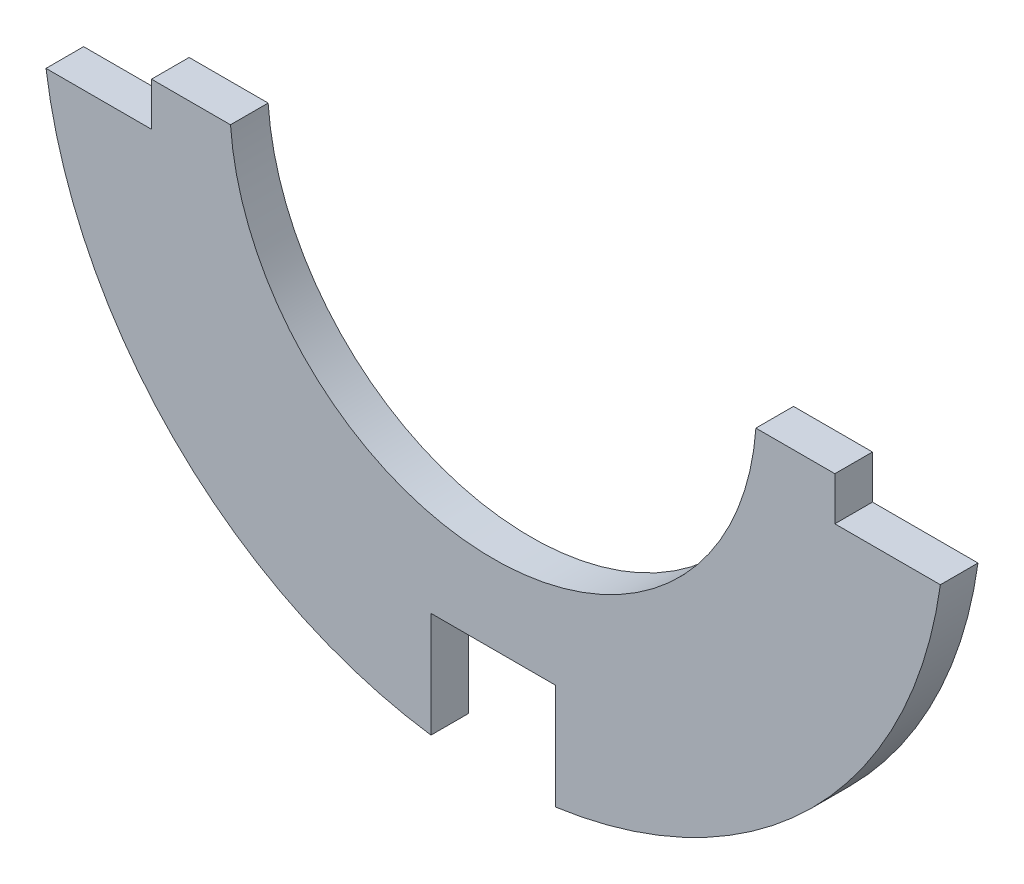
ISO-10303-21;
HEADER;
FILE_DESCRIPTION(('STEP AP214'),'2;1');
FILE_NAME('part.step','',(''),(''),'','','');
FILE_SCHEMA(('AUTOMOTIVE_DESIGN { 1 0 10303 214 1 1 1 1 }'));
ENDSEC;
DATA;
#1=APPLICATION_CONTEXT('core data for automotive mechanical design processes');
#2=APPLICATION_PROTOCOL_DEFINITION('international standard','automotive_design',2000,#1);
#3=PRODUCT_CONTEXT('',#1,'mechanical');
#4=PRODUCT('Part','Part','',(#3));
#5=PRODUCT_RELATED_PRODUCT_CATEGORY('part','',(#4));
#6=PRODUCT_DEFINITION_FORMATION('','',#4);
#7=PRODUCT_DEFINITION_CONTEXT('part definition',#1,'design');
#8=PRODUCT_DEFINITION('design','',#6,#7);
#9=PRODUCT_DEFINITION_SHAPE('','',#8);
#10=(LENGTH_UNIT() NAMED_UNIT(*) SI_UNIT(.MILLI.,.METRE.));
#11=(NAMED_UNIT(*) PLANE_ANGLE_UNIT() SI_UNIT($,.RADIAN.));
#12=(NAMED_UNIT(*) SI_UNIT($,.STERADIAN.) SOLID_ANGLE_UNIT());
#13=UNCERTAINTY_MEASURE_WITH_UNIT(LENGTH_MEASURE(1.E-05),#10,'distance_accuracy_value','');
#14=(GEOMETRIC_REPRESENTATION_CONTEXT(3) GLOBAL_UNCERTAINTY_ASSIGNED_CONTEXT((#13)) GLOBAL_UNIT_ASSIGNED_CONTEXT((#10,
#11,#12)) REPRESENTATION_CONTEXT('',''));
#15=CARTESIAN_POINT('',(0.,0.,0.));
#16=DIRECTION('',(0.,0.,1.));
#17=DIRECTION('',(1.,0.,0.));
#18=AXIS2_PLACEMENT_3D('',#15,#16,#17);
#19=CARTESIAN_POINT('',(21.0000000000125,-150.946215586875,6.35));
#20=DIRECTION('',(-1.,0.,0.));
#21=DIRECTION('',(0.,0.,1.));
#22=AXIS2_PLACEMENT_3D('',#19,#20,#21);
#23=PLANE('',#22);
#24=DIRECTION('',(0.,1.,0.));
#25=VECTOR('',#24,1.);
#26=CARTESIAN_POINT('',(21.0000000000125,-150.946215586875,-6.35));
#27=LINE('',#26,#25);
#28=CARTESIAN_POINT('',(21.0000000000124,-150.946215586875,-6.35));
#29=VERTEX_POINT('',#28);
#30=CARTESIAN_POINT('',(21.0000000000125,-115.332000000002,-6.35));
#31=VERTEX_POINT('',#30);
#32=EDGE_CURVE('E124',#29,#31,#27,.T.);
#33=ORIENTED_EDGE('',*,*,#32,.F.);
#34=DIRECTION('',(0.,0.,-1.));
#35=VECTOR('',#34,1.);
#36=CARTESIAN_POINT('',(21.0000000000124,-150.946215586875,6.35));
#37=LINE('',#36,#35);
#38=CARTESIAN_POINT('',(21.0000000000124,-150.946215586875,6.35));
#39=VERTEX_POINT('',#38);
#40=EDGE_CURVE('E11',#39,#29,#37,.T.);
#41=ORIENTED_EDGE('',*,*,#40,.F.);
#42=DIRECTION('',(0.,1.,0.));
#43=VECTOR('',#42,1.);
#44=CARTESIAN_POINT('',(21.0000000000125,-150.946215586875,6.35));
#45=LINE('',#44,#43);
#46=CARTESIAN_POINT('',(21.0000000000125,-115.332000000002,6.35));
#47=VERTEX_POINT('',#46);
#48=EDGE_CURVE('E140',#39,#47,#45,.T.);
#49=ORIENTED_EDGE('',*,*,#48,.T.);
#50=DIRECTION('',(0.,0.,-1.));
#51=VECTOR('',#50,1.);
#52=CARTESIAN_POINT('',(21.0000000000125,-115.332000000002,6.35));
#53=LINE('',#52,#51);
#54=EDGE_CURVE('E37',#47,#31,#53,.T.);
#55=ORIENTED_EDGE('',*,*,#54,.T.);
#56=EDGE_LOOP('',(#33,#41,#49,#55));
#57=FACE_BOUND('',#56,.T.);
#58=ADVANCED_FACE('F34',(#57),#23,.T.);
#59=CARTESIAN_POINT('',(0.,0.,6.35));
#60=DIRECTION('',(0.,0.,-1.));
#61=DIRECTION('',(-1.,0.,0.));
#62=AXIS2_PLACEMENT_3D('',#59,#60,#61);
#63=CYLINDRICAL_SURFACE('',#62,152.4);
#64=CARTESIAN_POINT('',(0.,0.,-6.35));
#65=DIRECTION('',(0.,0.,1.));
#66=DIRECTION('',(1.,0.,0.));
#67=AXIS2_PLACEMENT_3D('',#64,#65,#66);
#68=CIRCLE('',#67,152.4);
#69=CARTESIAN_POINT('',(150.946215586876,-21.0000000000047,-6.35));
#70=VERTEX_POINT('',#69);
#71=EDGE_CURVE('E74',#29,#70,#68,.T.);
#72=ORIENTED_EDGE('',*,*,#71,.T.);
#73=DIRECTION('',(0.,0.,-1.));
#74=VECTOR('',#73,1.);
#75=CARTESIAN_POINT('',(150.946215586876,-21.0000000000047,6.35));
#76=LINE('',#75,#74);
#77=CARTESIAN_POINT('',(150.946215586876,-21.0000000000047,6.35));
#78=VERTEX_POINT('',#77);
#79=EDGE_CURVE('E43',#78,#70,#76,.T.);
#80=ORIENTED_EDGE('',*,*,#79,.F.);
#81=CARTESIAN_POINT('',(0.,0.,6.35));
#82=DIRECTION('',(0.,0.,1.));
#83=DIRECTION('',(1.,0.,0.));
#84=AXIS2_PLACEMENT_3D('',#81,#82,#83);
#85=CIRCLE('',#84,152.4);
#86=EDGE_CURVE('E102',#39,#78,#85,.T.);
#87=ORIENTED_EDGE('',*,*,#86,.F.);
#88=ORIENTED_EDGE('',*,*,#40,.T.);
#89=EDGE_LOOP('',(#72,#80,#87,#88));
#90=FACE_BOUND('',#89,.T.);
#91=ADVANCED_FACE('F261',(#90),#63,.T.);
#92=CARTESIAN_POINT('',(150.946215586876,-21.0000000000046,6.35));
#93=DIRECTION('',(0.,-1.,0.));
#94=DIRECTION('',(1.,0.,0.));
#95=AXIS2_PLACEMENT_3D('',#92,#93,#94);
#96=PLANE('',#95);
#97=DIRECTION('',(-1.,0.,0.));
#98=VECTOR('',#97,1.);
#99=CARTESIAN_POINT('',(150.946215586876,-21.0000000000046,-6.35));
#100=LINE('',#99,#98);
#101=CARTESIAN_POINT('',(115.332,-21.0000000000046,-6.35));
#102=VERTEX_POINT('',#101);
#103=EDGE_CURVE('E109',#70,#102,#100,.T.);
#104=ORIENTED_EDGE('',*,*,#103,.T.);
#105=DIRECTION('',(0.,0.,-1.));
#106=VECTOR('',#105,1.);
#107=CARTESIAN_POINT('',(115.332,-21.0000000000046,6.35));
#108=LINE('',#107,#106);
#109=CARTESIAN_POINT('',(115.332,-21.0000000000046,6.35));
#110=VERTEX_POINT('',#109);
#111=EDGE_CURVE('E106',#110,#102,#108,.T.);
#112=ORIENTED_EDGE('',*,*,#111,.F.);
#113=DIRECTION('',(-1.,0.,0.));
#114=VECTOR('',#113,1.);
#115=CARTESIAN_POINT('',(150.946215586876,-21.0000000000046,6.35));
#116=LINE('',#115,#114);
#117=EDGE_CURVE('E96',#78,#110,#116,.T.);
#118=ORIENTED_EDGE('',*,*,#117,.F.);
#119=ORIENTED_EDGE('',*,*,#79,.T.);
#120=EDGE_LOOP('',(#104,#112,#118,#119));
#121=FACE_BOUND('',#120,.T.);
#122=ADVANCED_FACE('F107',(#121),#96,.F.);
#123=CARTESIAN_POINT('',(115.332,-21.0000000000046,6.35));
#124=DIRECTION('',(-1.,0.,0.));
#125=DIRECTION('',(0.,0.,1.));
#126=AXIS2_PLACEMENT_3D('',#123,#124,#125);
#127=PLANE('',#126);
#128=DIRECTION('',(0.,1.,0.));
#129=VECTOR('',#128,1.);
#130=CARTESIAN_POINT('',(115.332,-21.0000000000046,-6.35));
#131=LINE('',#130,#129);
#132=CARTESIAN_POINT('',(115.332,-6.35000000000017,-6.35));
#133=VERTEX_POINT('',#132);
#134=EDGE_CURVE('E137',#102,#133,#131,.T.);
#135=ORIENTED_EDGE('',*,*,#134,.T.);
#136=DIRECTION('',(0.,0.,-1.));
#137=VECTOR('',#136,1.);
#138=CARTESIAN_POINT('',(115.332,-6.35000000000017,6.35));
#139=LINE('',#138,#137);
#140=CARTESIAN_POINT('',(115.332,-6.35000000000017,6.35));
#141=VERTEX_POINT('',#140);
#142=EDGE_CURVE('E112',#141,#133,#139,.T.);
#143=ORIENTED_EDGE('',*,*,#142,.F.);
#144=DIRECTION('',(0.,1.,0.));
#145=VECTOR('',#144,1.);
#146=CARTESIAN_POINT('',(115.332,-21.0000000000046,6.35));
#147=LINE('',#146,#145);
#148=EDGE_CURVE('E100',#110,#141,#147,.T.);
#149=ORIENTED_EDGE('',*,*,#148,.F.);
#150=ORIENTED_EDGE('',*,*,#111,.T.);
#151=EDGE_LOOP('',(#135,#143,#149,#150));
#152=FACE_BOUND('',#151,.T.);
#153=ADVANCED_FACE('F114',(#152),#127,.F.);
#154=CARTESIAN_POINT('',(115.332,-6.35000000000017,6.35));
#155=DIRECTION('',(0.,-1.,0.));
#156=DIRECTION('',(1.,0.,0.));
#157=AXIS2_PLACEMENT_3D('',#154,#155,#156);
#158=PLANE('',#157);
#159=DIRECTION('',(-1.,0.,0.));
#160=VECTOR('',#159,1.);
#161=CARTESIAN_POINT('',(115.332,-6.35000000000017,-6.35));
#162=LINE('',#161,#160);
#163=CARTESIAN_POINT('',(88.6729242779328,-6.35000000000079,-6.35));
#164=VERTEX_POINT('',#163);
#165=EDGE_CURVE('E134',#133,#164,#162,.T.);
#166=ORIENTED_EDGE('',*,*,#165,.T.);
#167=DIRECTION('',(0.,0.,-1.));
#168=VECTOR('',#167,1.);
#169=CARTESIAN_POINT('',(88.6729242779328,-6.35000000000079,6.35));
#170=LINE('',#169,#168);
#171=CARTESIAN_POINT('',(88.6729242779328,-6.35000000000079,6.35));
#172=VERTEX_POINT('',#171);
#173=EDGE_CURVE('E143',#172,#164,#170,.T.);
#174=ORIENTED_EDGE('',*,*,#173,.F.);
#175=DIRECTION('',(-1.,0.,0.));
#176=VECTOR('',#175,1.);
#177=CARTESIAN_POINT('',(115.332,-6.35000000000017,6.35));
#178=LINE('',#177,#176);
#179=EDGE_CURVE('E117',#141,#172,#178,.T.);
#180=ORIENTED_EDGE('',*,*,#179,.F.);
#181=ORIENTED_EDGE('',*,*,#142,.T.);
#182=EDGE_LOOP('',(#166,#174,#180,#181));
#183=FACE_BOUND('',#182,.T.);
#184=ADVANCED_FACE('F159',(#183),#158,.F.);
#185=CARTESIAN_POINT('',(0.,0.,6.35));
#186=DIRECTION('',(0.,0.,-1.));
#187=DIRECTION('',(-1.,0.,0.));
#188=AXIS2_PLACEMENT_3D('',#185,#186,#187);
#189=CYLINDRICAL_SURFACE('',#188,88.9);
#190=CARTESIAN_POINT('',(0.,0.,-6.35));
#191=DIRECTION('',(0.,0.,1.));
#192=DIRECTION('',(1.,0.,0.));
#193=AXIS2_PLACEMENT_3D('',#190,#191,#192);
#194=CIRCLE('',#193,88.9);
#195=CARTESIAN_POINT('',(-88.6729242779328,-6.35000000000079,-6.35));
#196=VERTEX_POINT('',#195);
#197=EDGE_CURVE('E131',#196,#164,#194,.T.);
#198=ORIENTED_EDGE('',*,*,#197,.F.);
#199=DIRECTION('',(0.,0.,-1.));
#200=VECTOR('',#199,1.);
#201=CARTESIAN_POINT('',(-88.6729242779328,-6.35000000000079,6.35));
#202=LINE('',#201,#200);
#203=CARTESIAN_POINT('',(-88.6729242779328,-6.35000000000079,6.35));
#204=VERTEX_POINT('',#203);
#205=EDGE_CURVE('E171',#204,#196,#202,.T.);
#206=ORIENTED_EDGE('',*,*,#205,.F.);
#207=CARTESIAN_POINT('',(0.,0.,6.35));
#208=DIRECTION('',(0.,0.,1.));
#209=DIRECTION('',(1.,0.,0.));
#210=AXIS2_PLACEMENT_3D('',#207,#208,#209);
#211=CIRCLE('',#210,88.9);
#212=EDGE_CURVE('E119',#204,#172,#211,.T.);
#213=ORIENTED_EDGE('',*,*,#212,.T.);
#214=ORIENTED_EDGE('',*,*,#173,.T.);
#215=EDGE_LOOP('',(#198,#206,#213,#214));
#216=FACE_BOUND('',#215,.T.);
#217=ADVANCED_FACE('F172',(#216),#189,.F.);
#218=CARTESIAN_POINT('',(1.25013773452466E-11,-115.332000000002,6.35));
#219=DIRECTION('',(0.,1.,0.));
#220=DIRECTION('',(-1.,0.,0.));
#221=AXIS2_PLACEMENT_3D('',#218,#219,#220);
#222=PLANE('',#221);
#223=DIRECTION('',(1.,0.,0.));
#224=VECTOR('',#223,1.);
#225=CARTESIAN_POINT('',(1.25013773452466E-11,-115.332000000002,-6.35));
#226=LINE('',#225,#224);
#227=CARTESIAN_POINT('',(-21.0000000000125,-115.332000000002,-6.35));
#228=VERTEX_POINT('',#227);
#229=EDGE_CURVE('E127',#228,#31,#226,.T.);
#230=ORIENTED_EDGE('',*,*,#229,.T.);
#231=ORIENTED_EDGE('',*,*,#54,.F.);
#232=DIRECTION('',(1.,0.,0.));
#233=VECTOR('',#232,1.);
#234=CARTESIAN_POINT('',(1.25013773452466E-11,-115.332000000002,6.35));
#235=LINE('',#234,#233);
#236=CARTESIAN_POINT('',(-21.0000000000125,-115.332000000002,6.35));
#237=VERTEX_POINT('',#236);
#238=EDGE_CURVE('E84',#237,#47,#235,.T.);
#239=ORIENTED_EDGE('',*,*,#238,.F.);
#240=DIRECTION('',(0.,0.,-1.));
#241=VECTOR('',#240,1.);
#242=CARTESIAN_POINT('',(-21.0000000000125,-115.332000000002,6.35));
#243=LINE('',#242,#241);
#244=EDGE_CURVE('E128',#237,#228,#243,.T.);
#245=ORIENTED_EDGE('',*,*,#244,.T.);
#246=EDGE_LOOP('',(#230,#231,#239,#245));
#247=FACE_BOUND('',#246,.T.);
#248=ADVANCED_FACE('F151',(#247),#222,.F.);
#249=CARTESIAN_POINT('',(0.,0.,6.35));
#250=DIRECTION('',(0.,0.,1.));
#251=DIRECTION('',(1.,0.,0.));
#252=AXIS2_PLACEMENT_3D('',#249,#250,#251);
#253=PLANE('',#252);
#254=ORIENTED_EDGE('',*,*,#48,.F.);
#255=ORIENTED_EDGE('',*,*,#86,.T.);
#256=ORIENTED_EDGE('',*,*,#117,.T.);
#257=ORIENTED_EDGE('',*,*,#148,.T.);
#258=ORIENTED_EDGE('',*,*,#179,.T.);
#259=ORIENTED_EDGE('',*,*,#212,.F.);
#260=DIRECTION('',(1.,0.,0.));
#261=VECTOR('',#260,1.);
#262=CARTESIAN_POINT('',(-115.332,-6.35000000000017,6.35));
#263=LINE('',#262,#261);
#264=CARTESIAN_POINT('',(-115.332,-6.35000000000017,6.35));
#265=VERTEX_POINT('',#264);
#266=EDGE_CURVE('E167',#265,#204,#263,.T.);
#267=ORIENTED_EDGE('',*,*,#266,.F.);
#268=DIRECTION('',(0.,1.,0.));
#269=VECTOR('',#268,1.);
#270=CARTESIAN_POINT('',(-115.332,-21.0000000000046,6.35));
#271=LINE('',#270,#269);
#272=CARTESIAN_POINT('',(-115.332,-21.0000000000046,6.35));
#273=VERTEX_POINT('',#272);
#274=EDGE_CURVE('E183',#273,#265,#271,.T.);
#275=ORIENTED_EDGE('',*,*,#274,.F.);
#276=DIRECTION('',(1.,0.,0.));
#277=VECTOR('',#276,1.);
#278=CARTESIAN_POINT('',(-150.946215586876,-21.0000000000046,6.35));
#279=LINE('',#278,#277);
#280=CARTESIAN_POINT('',(-150.946215586876,-21.0000000000047,6.35));
#281=VERTEX_POINT('',#280);
#282=EDGE_CURVE('E188',#281,#273,#279,.T.);
#283=ORIENTED_EDGE('',*,*,#282,.F.);
#284=CARTESIAN_POINT('',(0.,0.,6.35));
#285=DIRECTION('',(0.,0.,-1.));
#286=DIRECTION('',(-1.,0.,0.));
#287=AXIS2_PLACEMENT_3D('',#284,#285,#286);
#288=CIRCLE('',#287,152.4);
#289=CARTESIAN_POINT('',(-21.0000000000124,-150.946215586875,6.35));
#290=VERTEX_POINT('',#289);
#291=EDGE_CURVE('E225',#290,#281,#288,.T.);
#292=ORIENTED_EDGE('',*,*,#291,.F.);
#293=DIRECTION('',(0.,1.,0.));
#294=VECTOR('',#293,1.);
#295=CARTESIAN_POINT('',(-21.0000000000125,-150.946215586875,6.35));
#296=LINE('',#295,#294);
#297=EDGE_CURVE('E205',#290,#237,#296,.T.);
#298=ORIENTED_EDGE('',*,*,#297,.T.);
#299=ORIENTED_EDGE('',*,*,#238,.T.);
#300=EDGE_LOOP('',(#254,#255,#256,#257,#258,#259,#267,#275,#283,#292,#298,#299));
#301=FACE_BOUND('',#300,.T.);
#302=ADVANCED_FACE('F98',(#301),#253,.T.);
#303=CARTESIAN_POINT('',(0.,0.,-6.35));
#304=DIRECTION('',(0.,0.,1.));
#305=DIRECTION('',(1.,0.,0.));
#306=AXIS2_PLACEMENT_3D('',#303,#304,#305);
#307=PLANE('',#306);
#308=ORIENTED_EDGE('',*,*,#32,.T.);
#309=ORIENTED_EDGE('',*,*,#229,.F.);
#310=DIRECTION('',(0.,1.,0.));
#311=VECTOR('',#310,1.);
#312=CARTESIAN_POINT('',(-21.0000000000125,-150.946215586875,-6.35));
#313=LINE('',#312,#311);
#314=CARTESIAN_POINT('',(-21.0000000000124,-150.946215586875,-6.35));
#315=VERTEX_POINT('',#314);
#316=EDGE_CURVE('E192',#315,#228,#313,.T.);
#317=ORIENTED_EDGE('',*,*,#316,.F.);
#318=CARTESIAN_POINT('',(0.,0.,-6.35));
#319=DIRECTION('',(0.,0.,-1.));
#320=DIRECTION('',(-1.,0.,0.));
#321=AXIS2_PLACEMENT_3D('',#318,#319,#320);
#322=CIRCLE('',#321,152.4);
#323=CARTESIAN_POINT('',(-150.946215586876,-21.0000000000047,-6.35));
#324=VERTEX_POINT('',#323);
#325=EDGE_CURVE('E194',#315,#324,#322,.T.);
#326=ORIENTED_EDGE('',*,*,#325,.T.);
#327=DIRECTION('',(1.,0.,0.));
#328=VECTOR('',#327,1.);
#329=CARTESIAN_POINT('',(-150.946215586876,-21.0000000000046,-6.35));
#330=LINE('',#329,#328);
#331=CARTESIAN_POINT('',(-115.332,-21.0000000000046,-6.35));
#332=VERTEX_POINT('',#331);
#333=EDGE_CURVE('E197',#324,#332,#330,.T.);
#334=ORIENTED_EDGE('',*,*,#333,.T.);
#335=DIRECTION('',(0.,1.,0.));
#336=VECTOR('',#335,1.);
#337=CARTESIAN_POINT('',(-115.332,-21.0000000000046,-6.35));
#338=LINE('',#337,#336);
#339=CARTESIAN_POINT('',(-115.332,-6.35000000000017,-6.35));
#340=VERTEX_POINT('',#339);
#341=EDGE_CURVE('E200',#332,#340,#338,.T.);
#342=ORIENTED_EDGE('',*,*,#341,.T.);
#343=DIRECTION('',(1.,0.,0.));
#344=VECTOR('',#343,1.);
#345=CARTESIAN_POINT('',(-115.332,-6.35000000000017,-6.35));
#346=LINE('',#345,#344);
#347=EDGE_CURVE('E203',#340,#196,#346,.T.);
#348=ORIENTED_EDGE('',*,*,#347,.T.);
#349=ORIENTED_EDGE('',*,*,#197,.T.);
#350=ORIENTED_EDGE('',*,*,#165,.F.);
#351=ORIENTED_EDGE('',*,*,#134,.F.);
#352=ORIENTED_EDGE('',*,*,#103,.F.);
#353=ORIENTED_EDGE('',*,*,#71,.F.);
#354=EDGE_LOOP('',(#308,#309,#317,#326,#334,#342,#348,#349,#350,#351,#352,#353));
#355=FACE_BOUND('',#354,.T.);
#356=ADVANCED_FACE('F156',(#355),#307,.F.);
#357=CARTESIAN_POINT('',(-21.0000000000125,-150.946215586875,6.35));
#358=DIRECTION('',(-1.,0.,0.));
#359=DIRECTION('',(0.,0.,1.));
#360=AXIS2_PLACEMENT_3D('',#357,#358,#359);
#361=PLANE('',#360);
#362=ORIENTED_EDGE('',*,*,#316,.T.);
#363=ORIENTED_EDGE('',*,*,#244,.F.);
#364=ORIENTED_EDGE('',*,*,#297,.F.);
#365=DIRECTION('',(0.,0.,-1.));
#366=VECTOR('',#365,1.);
#367=CARTESIAN_POINT('',(-21.0000000000124,-150.946215586875,6.35));
#368=LINE('',#367,#366);
#369=EDGE_CURVE('E182',#290,#315,#368,.T.);
#370=ORIENTED_EDGE('',*,*,#369,.T.);
#371=EDGE_LOOP('',(#362,#363,#364,#370));
#372=FACE_BOUND('',#371,.T.);
#373=ADVANCED_FACE('F236',(#372),#361,.F.);
#374=CARTESIAN_POINT('',(-115.332,-6.35000000000017,6.35));
#375=DIRECTION('',(0.,1.,0.));
#376=DIRECTION('',(-1.,0.,0.));
#377=AXIS2_PLACEMENT_3D('',#374,#375,#376);
#378=PLANE('',#377);
#379=ORIENTED_EDGE('',*,*,#347,.F.);
#380=DIRECTION('',(0.,0.,-1.));
#381=VECTOR('',#380,1.);
#382=CARTESIAN_POINT('',(-115.332,-6.35000000000017,6.35));
#383=LINE('',#382,#381);
#384=EDGE_CURVE('E177',#265,#340,#383,.T.);
#385=ORIENTED_EDGE('',*,*,#384,.F.);
#386=ORIENTED_EDGE('',*,*,#266,.T.);
#387=ORIENTED_EDGE('',*,*,#205,.T.);
#388=EDGE_LOOP('',(#379,#385,#386,#387));
#389=FACE_BOUND('',#388,.T.);
#390=ADVANCED_FACE('F180',(#389),#378,.T.);
#391=CARTESIAN_POINT('',(-115.332,-21.0000000000046,6.35));
#392=DIRECTION('',(-1.,0.,0.));
#393=DIRECTION('',(0.,0.,1.));
#394=AXIS2_PLACEMENT_3D('',#391,#392,#393);
#395=PLANE('',#394);
#396=ORIENTED_EDGE('',*,*,#341,.F.);
#397=DIRECTION('',(0.,0.,-1.));
#398=VECTOR('',#397,1.);
#399=CARTESIAN_POINT('',(-115.332,-21.0000000000046,6.35));
#400=LINE('',#399,#398);
#401=EDGE_CURVE('E208',#273,#332,#400,.T.);
#402=ORIENTED_EDGE('',*,*,#401,.F.);
#403=ORIENTED_EDGE('',*,*,#274,.T.);
#404=ORIENTED_EDGE('',*,*,#384,.T.);
#405=EDGE_LOOP('',(#396,#402,#403,#404));
#406=FACE_BOUND('',#405,.T.);
#407=ADVANCED_FACE('F249',(#406),#395,.T.);
#408=CARTESIAN_POINT('',(-150.946215586876,-21.0000000000046,6.35));
#409=DIRECTION('',(0.,1.,0.));
#410=DIRECTION('',(-1.,0.,0.));
#411=AXIS2_PLACEMENT_3D('',#408,#409,#410);
#412=PLANE('',#411);
#413=ORIENTED_EDGE('',*,*,#333,.F.);
#414=DIRECTION('',(0.,0.,-1.));
#415=VECTOR('',#414,1.);
#416=CARTESIAN_POINT('',(-150.946215586876,-21.0000000000047,6.35));
#417=LINE('',#416,#415);
#418=EDGE_CURVE('E186',#281,#324,#417,.T.);
#419=ORIENTED_EDGE('',*,*,#418,.F.);
#420=ORIENTED_EDGE('',*,*,#282,.T.);
#421=ORIENTED_EDGE('',*,*,#401,.T.);
#422=EDGE_LOOP('',(#413,#419,#420,#421));
#423=FACE_BOUND('',#422,.T.);
#424=ADVANCED_FACE('F231',(#423),#412,.T.);
#425=CARTESIAN_POINT('',(0.,0.,6.35));
#426=DIRECTION('',(0.,0.,-1.));
#427=DIRECTION('',(-1.,0.,0.));
#428=AXIS2_PLACEMENT_3D('',#425,#426,#427);
#429=CYLINDRICAL_SURFACE('',#428,152.4);
#430=ORIENTED_EDGE('',*,*,#325,.F.);
#431=ORIENTED_EDGE('',*,*,#369,.F.);
#432=ORIENTED_EDGE('',*,*,#291,.T.);
#433=ORIENTED_EDGE('',*,*,#418,.T.);
#434=EDGE_LOOP('',(#430,#431,#432,#433));
#435=FACE_BOUND('',#434,.T.);
#436=ADVANCED_FACE('F220',(#435),#429,.T.);
#437=CLOSED_SHELL('',(#58,#91,#122,#153,#184,#217,#248,#302,#356,#373,#390,#407,#424,#436));
#438=MANIFOLD_SOLID_BREP('B2',#437);
#439=ADVANCED_BREP_SHAPE_REPRESENTATION('',(#18,#438),#14);
#440=SHAPE_DEFINITION_REPRESENTATION(#9,#439);
ENDSEC;
END-ISO-10303-21;
